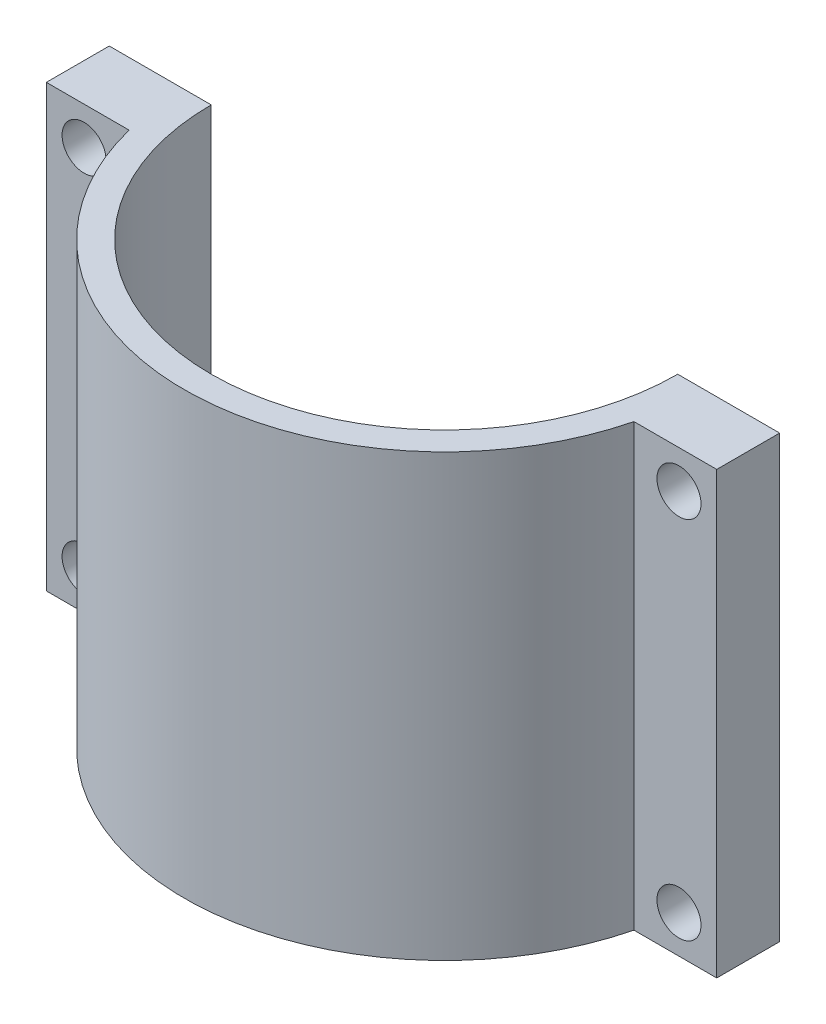
ISO-10303-21;
HEADER;
FILE_DESCRIPTION(('STEP AP214'),'2;1');
FILE_NAME('part.step','',(''),(''),'','','');
FILE_SCHEMA(('AUTOMOTIVE_DESIGN { 1 0 10303 214 1 1 1 1 }'));
ENDSEC;
DATA;
#1=APPLICATION_CONTEXT('core data for automotive mechanical design processes');
#2=APPLICATION_PROTOCOL_DEFINITION('international standard','automotive_design',2000,#1);
#3=PRODUCT_CONTEXT('',#1,'mechanical');
#4=PRODUCT('Part','Part','',(#3));
#5=PRODUCT_RELATED_PRODUCT_CATEGORY('part','',(#4));
#6=PRODUCT_DEFINITION_FORMATION('','',#4);
#7=PRODUCT_DEFINITION_CONTEXT('part definition',#1,'design');
#8=PRODUCT_DEFINITION('design','',#6,#7);
#9=PRODUCT_DEFINITION_SHAPE('','',#8);
#10=(LENGTH_UNIT() NAMED_UNIT(*) SI_UNIT(.MILLI.,.METRE.));
#11=(NAMED_UNIT(*) PLANE_ANGLE_UNIT() SI_UNIT($,.RADIAN.));
#12=(NAMED_UNIT(*) SI_UNIT($,.STERADIAN.) SOLID_ANGLE_UNIT());
#13=UNCERTAINTY_MEASURE_WITH_UNIT(LENGTH_MEASURE(1.E-05),#10,'distance_accuracy_value','');
#14=(GEOMETRIC_REPRESENTATION_CONTEXT(3) GLOBAL_UNCERTAINTY_ASSIGNED_CONTEXT((#13)) GLOBAL_UNIT_ASSIGNED_CONTEXT((#10,
#11,#12)) REPRESENTATION_CONTEXT('',''));
#15=CARTESIAN_POINT('',(0.,0.,0.));
#16=DIRECTION('',(0.,0.,1.));
#17=DIRECTION('',(1.,0.,0.));
#18=AXIS2_PLACEMENT_3D('',#15,#16,#17);
#19=CARTESIAN_POINT('',(23.635,-78.2195250949207,0.));
#20=DIRECTION('',(0.,1.,0.));
#21=DIRECTION('',(0.,0.,1.));
#22=AXIS2_PLACEMENT_3D('',#19,#20,#21);
#23=CYLINDRICAL_SURFACE('',#22,20.67);
#24=CARTESIAN_POINT('',(23.635,-32.,0.));
#25=DIRECTION('',(0.,1.,0.));
#26=DIRECTION('',(0.,0.,1.));
#27=AXIS2_PLACEMENT_3D('',#24,#25,#26);
#28=CIRCLE('',#27,20.67);
#29=CARTESIAN_POINT('',(43.6911436971318,-32.,5.));
#30=VERTEX_POINT('',#29);
#31=CARTESIAN_POINT('',(3.57885630286819,-32.,5.));
#32=VERTEX_POINT('',#31);
#33=EDGE_CURVE('E59',#30,#32,#28,.F.);
#34=ORIENTED_EDGE('',*,*,#33,.F.);
#35=DIRECTION('',(0.,1.,0.));
#36=VECTOR('',#35,1.);
#37=CARTESIAN_POINT('',(43.6911436971318,-78.2195250949207,5.));
#38=LINE('',#37,#36);
#39=CARTESIAN_POINT('',(43.6911436971318,3.00000000000002,5.));
#40=VERTEX_POINT('',#39);
#41=EDGE_CURVE('E11',#30,#40,#38,.T.);
#42=ORIENTED_EDGE('',*,*,#41,.T.);
#43=CARTESIAN_POINT('',(23.635,3.00000000000002,0.));
#44=DIRECTION('',(0.,1.,0.));
#45=DIRECTION('',(0.,0.,1.));
#46=AXIS2_PLACEMENT_3D('',#43,#44,#45);
#47=CIRCLE('',#46,20.67);
#48=CARTESIAN_POINT('',(3.57885630286819,3.00000000000002,5.));
#49=VERTEX_POINT('',#48);
#50=EDGE_CURVE('E145',#49,#40,#47,.T.);
#51=ORIENTED_EDGE('',*,*,#50,.F.);
#52=DIRECTION('',(0.,1.,0.));
#53=VECTOR('',#52,1.);
#54=CARTESIAN_POINT('',(3.5788563028682,-78.2195250949207,5.));
#55=LINE('',#54,#53);
#56=EDGE_CURVE('E111',#49,#32,#55,.F.);
#57=ORIENTED_EDGE('',*,*,#56,.T.);
#58=EDGE_LOOP('',(#34,#42,#51,#57));
#59=FACE_BOUND('',#58,.T.);
#60=ADVANCED_FACE('F39',(#59),#23,.T.);
#61=CARTESIAN_POINT('',(0.,0.,5.));
#62=DIRECTION('',(0.,0.,1.));
#63=DIRECTION('',(1.,0.,0.));
#64=AXIS2_PLACEMENT_3D('',#61,#62,#63);
#65=PLANE('',#64);
#66=ORIENTED_EDGE('',*,*,#56,.F.);
#67=DIRECTION('',(-1.,0.,0.));
#68=VECTOR('',#67,1.);
#69=CARTESIAN_POINT('',(-3.,3.00000000000008,5.));
#70=LINE('',#69,#68);
#71=CARTESIAN_POINT('',(-3.,3.00000000000008,5.));
#72=VERTEX_POINT('',#71);
#73=EDGE_CURVE('E178',#49,#72,#70,.T.);
#74=ORIENTED_EDGE('',*,*,#73,.T.);
#75=DIRECTION('',(0.,-1.,0.));
#76=VECTOR('',#75,1.);
#77=CARTESIAN_POINT('',(-3.,3.00000000000008,5.));
#78=LINE('',#77,#76);
#79=CARTESIAN_POINT('',(-3.,-32.,5.));
#80=VERTEX_POINT('',#79);
#81=EDGE_CURVE('E173',#72,#80,#78,.T.);
#82=ORIENTED_EDGE('',*,*,#81,.T.);
#83=DIRECTION('',(1.,0.,0.));
#84=VECTOR('',#83,1.);
#85=CARTESIAN_POINT('',(-3.,-32.,5.));
#86=LINE('',#85,#84);
#87=EDGE_CURVE('E175',#80,#32,#86,.T.);
#88=ORIENTED_EDGE('',*,*,#87,.T.);
#89=EDGE_LOOP('',(#66,#74,#82,#88));
#90=FACE_BOUND('',#89,.T.);
#91=CARTESIAN_POINT('',(0.,0.,5.));
#92=DIRECTION('',(0.,0.,1.));
#93=DIRECTION('',(1.,0.,0.));
#94=AXIS2_PLACEMENT_3D('',#91,#92,#93);
#95=CIRCLE('',#94,1.74999999999997);
#96=CARTESIAN_POINT('',(1.74999999999997,0.,5.));
#97=VERTEX_POINT('',#96);
#98=EDGE_CURVE('E167',#97,#97,#95,.T.);
#99=ORIENTED_EDGE('',*,*,#98,.F.);
#100=EDGE_LOOP('',(#99));
#101=FACE_BOUND('',#100,.T.);
#102=CARTESIAN_POINT('',(0.,-29.,5.));
#103=DIRECTION('',(0.,0.,1.));
#104=DIRECTION('',(-1.,0.,0.));
#105=AXIS2_PLACEMENT_3D('',#102,#103,#104);
#106=CIRCLE('',#105,1.75);
#107=CARTESIAN_POINT('',(-1.74999999999999,-29.,5.));
#108=VERTEX_POINT('',#107);
#109=EDGE_CURVE('E161',#108,#108,#106,.T.);
#110=ORIENTED_EDGE('',*,*,#109,.F.);
#111=EDGE_LOOP('',(#110));
#112=FACE_BOUND('',#111,.T.);
#113=ADVANCED_FACE('F211',(#90,#101,#112),#65,.T.);
#114=CARTESIAN_POINT('',(0.,0.,0.));
#115=DIRECTION('',(0.,0.,1.));
#116=DIRECTION('',(1.,0.,0.));
#117=AXIS2_PLACEMENT_3D('',#114,#115,#116);
#118=PLANE('',#117);
#119=DIRECTION('',(0.,-1.,0.));
#120=VECTOR('',#119,1.);
#121=CARTESIAN_POINT('',(-3.,-32.,0.));
#122=LINE('',#121,#120);
#123=CARTESIAN_POINT('',(-3.,3.00000000000008,0.));
#124=VERTEX_POINT('',#123);
#125=CARTESIAN_POINT('',(-3.,-32.,0.));
#126=VERTEX_POINT('',#125);
#127=EDGE_CURVE('E170',#124,#126,#122,.T.);
#128=ORIENTED_EDGE('',*,*,#127,.F.);
#129=DIRECTION('',(-1.,0.,0.));
#130=VECTOR('',#129,1.);
#131=CARTESIAN_POINT('',(-3.,3.00000000000008,0.));
#132=LINE('',#131,#130);
#133=CARTESIAN_POINT('',(5.1,3.,0.));
#134=VERTEX_POINT('',#133);
#135=EDGE_CURVE('E176',#134,#124,#132,.T.);
#136=ORIENTED_EDGE('',*,*,#135,.F.);
#137=DIRECTION('',(0.,1.,0.));
#138=VECTOR('',#137,1.);
#139=CARTESIAN_POINT('',(5.1,3.,0.));
#140=LINE('',#139,#138);
#141=CARTESIAN_POINT('',(5.10000000000001,-32.,0.));
#142=VERTEX_POINT('',#141);
#143=EDGE_CURVE('E184',#142,#134,#140,.T.);
#144=ORIENTED_EDGE('',*,*,#143,.F.);
#145=DIRECTION('',(1.,0.,0.));
#146=VECTOR('',#145,1.);
#147=CARTESIAN_POINT('',(-3.,-32.,0.));
#148=LINE('',#147,#146);
#149=EDGE_CURVE('E182',#126,#142,#148,.T.);
#150=ORIENTED_EDGE('',*,*,#149,.F.);
#151=EDGE_LOOP('',(#128,#136,#144,#150));
#152=FACE_BOUND('',#151,.T.);
#153=CARTESIAN_POINT('',(0.,0.,0.));
#154=DIRECTION('',(0.,0.,1.));
#155=DIRECTION('',(1.,0.,0.));
#156=AXIS2_PLACEMENT_3D('',#153,#154,#155);
#157=CIRCLE('',#156,1.74999999999997);
#158=CARTESIAN_POINT('',(1.74999999999997,0.,0.));
#159=VERTEX_POINT('',#158);
#160=EDGE_CURVE('E164',#159,#159,#157,.T.);
#161=ORIENTED_EDGE('',*,*,#160,.T.);
#162=EDGE_LOOP('',(#161));
#163=FACE_BOUND('',#162,.T.);
#164=CARTESIAN_POINT('',(0.,-29.,0.));
#165=DIRECTION('',(0.,0.,1.));
#166=DIRECTION('',(-1.,0.,0.));
#167=AXIS2_PLACEMENT_3D('',#164,#165,#166);
#168=CIRCLE('',#167,1.75);
#169=CARTESIAN_POINT('',(-1.74999999999999,-29.,0.));
#170=VERTEX_POINT('',#169);
#171=EDGE_CURVE('E160',#170,#170,#168,.T.);
#172=ORIENTED_EDGE('',*,*,#171,.T.);
#173=EDGE_LOOP('',(#172));
#174=FACE_BOUND('',#173,.T.);
#175=ADVANCED_FACE('F197',(#152,#163,#174),#118,.F.);
#176=CARTESIAN_POINT('',(-3.,-32.,5.));
#177=DIRECTION('',(1.,0.,0.));
#178=DIRECTION('',(0.,0.,-1.));
#179=AXIS2_PLACEMENT_3D('',#176,#177,#178);
#180=PLANE('',#179);
#181=ORIENTED_EDGE('',*,*,#127,.T.);
#182=DIRECTION('',(0.,0.,-1.));
#183=VECTOR('',#182,1.);
#184=CARTESIAN_POINT('',(-3.,-32.,5.));
#185=LINE('',#184,#183);
#186=EDGE_CURVE('E47',#80,#126,#185,.T.);
#187=ORIENTED_EDGE('',*,*,#186,.F.);
#188=ORIENTED_EDGE('',*,*,#81,.F.);
#189=DIRECTION('',(0.,0.,-1.));
#190=VECTOR('',#189,1.);
#191=CARTESIAN_POINT('',(-3.,3.00000000000008,5.));
#192=LINE('',#191,#190);
#193=EDGE_CURVE('E180',#72,#124,#192,.T.);
#194=ORIENTED_EDGE('',*,*,#193,.T.);
#195=EDGE_LOOP('',(#181,#187,#188,#194));
#196=FACE_BOUND('',#195,.T.);
#197=ADVANCED_FACE('F41',(#196),#180,.F.);
#198=CARTESIAN_POINT('',(-3.,-32.,5.));
#199=DIRECTION('',(0.,1.,0.));
#200=DIRECTION('',(0.,0.,1.));
#201=AXIS2_PLACEMENT_3D('',#198,#199,#200);
#202=PLANE('',#201);
#203=DIRECTION('',(1.,0.,0.));
#204=VECTOR('',#203,1.);
#205=CARTESIAN_POINT('',(42.17,-32.,0.));
#206=LINE('',#205,#204);
#207=CARTESIAN_POINT('',(42.17,-32.,0.));
#208=VERTEX_POINT('',#207);
#209=CARTESIAN_POINT('',(50.27,-32.,0.));
#210=VERTEX_POINT('',#209);
#211=EDGE_CURVE('E102',#208,#210,#206,.T.);
#212=ORIENTED_EDGE('',*,*,#211,.T.);
#213=DIRECTION('',(0.,0.,-1.));
#214=VECTOR('',#213,1.);
#215=CARTESIAN_POINT('',(50.27,-32.,5.));
#216=LINE('',#215,#214);
#217=CARTESIAN_POINT('',(50.27,-32.,5.));
#218=VERTEX_POINT('',#217);
#219=EDGE_CURVE('E105',#218,#210,#216,.T.);
#220=ORIENTED_EDGE('',*,*,#219,.F.);
#221=DIRECTION('',(1.,0.,0.));
#222=VECTOR('',#221,1.);
#223=CARTESIAN_POINT('',(50.27,-32.,5.));
#224=LINE('',#223,#222);
#225=EDGE_CURVE('E54',#30,#218,#224,.T.);
#226=ORIENTED_EDGE('',*,*,#225,.F.);
#227=ORIENTED_EDGE('',*,*,#33,.T.);
#228=ORIENTED_EDGE('',*,*,#87,.F.);
#229=ORIENTED_EDGE('',*,*,#186,.T.);
#230=ORIENTED_EDGE('',*,*,#149,.T.);
#231=CARTESIAN_POINT('',(23.635,-32.,0.));
#232=DIRECTION('',(0.,1.,0.));
#233=DIRECTION('',(0.,0.,1.));
#234=AXIS2_PLACEMENT_3D('',#231,#232,#233);
#235=CIRCLE('',#234,18.535);
#236=EDGE_CURVE('E107',#142,#208,#235,.T.);
#237=ORIENTED_EDGE('',*,*,#236,.T.);
#238=EDGE_LOOP('',(#212,#220,#226,#227,#228,#229,#230,#237));
#239=FACE_BOUND('',#238,.T.);
#240=ADVANCED_FACE('F104',(#239),#202,.F.);
#241=CARTESIAN_POINT('',(-3.,3.00000000000008,5.));
#242=DIRECTION('',(0.,-1.,0.));
#243=DIRECTION('',(1.,0.,0.));
#244=AXIS2_PLACEMENT_3D('',#241,#242,#243);
#245=PLANE('',#244);
#246=ORIENTED_EDGE('',*,*,#50,.T.);
#247=DIRECTION('',(-1.,0.,0.));
#248=VECTOR('',#247,1.);
#249=CARTESIAN_POINT('',(50.27,3.00000000000002,5.));
#250=LINE('',#249,#248);
#251=CARTESIAN_POINT('',(50.27,3.00000000000002,5.));
#252=VERTEX_POINT('',#251);
#253=EDGE_CURVE('E133',#252,#40,#250,.T.);
#254=ORIENTED_EDGE('',*,*,#253,.F.);
#255=DIRECTION('',(0.,0.,-1.));
#256=VECTOR('',#255,1.);
#257=CARTESIAN_POINT('',(50.27,3.00000000000002,5.));
#258=LINE('',#257,#256);
#259=CARTESIAN_POINT('',(50.27,3.00000000000002,0.));
#260=VERTEX_POINT('',#259);
#261=EDGE_CURVE('E122',#252,#260,#258,.T.);
#262=ORIENTED_EDGE('',*,*,#261,.T.);
#263=DIRECTION('',(-1.,0.,0.));
#264=VECTOR('',#263,1.);
#265=CARTESIAN_POINT('',(42.17,3.00000000000002,0.));
#266=LINE('',#265,#264);
#267=CARTESIAN_POINT('',(42.17,3.00000000000002,0.));
#268=VERTEX_POINT('',#267);
#269=EDGE_CURVE('E127',#260,#268,#266,.T.);
#270=ORIENTED_EDGE('',*,*,#269,.T.);
#271=CARTESIAN_POINT('',(23.635,3.00000000000002,0.));
#272=DIRECTION('',(0.,-1.,0.));
#273=DIRECTION('',(0.,0.,1.));
#274=AXIS2_PLACEMENT_3D('',#271,#272,#273);
#275=CIRCLE('',#274,18.535);
#276=EDGE_CURVE('E154',#268,#134,#275,.T.);
#277=ORIENTED_EDGE('',*,*,#276,.T.);
#278=ORIENTED_EDGE('',*,*,#135,.T.);
#279=ORIENTED_EDGE('',*,*,#193,.F.);
#280=ORIENTED_EDGE('',*,*,#73,.F.);
#281=EDGE_LOOP('',(#246,#254,#262,#270,#277,#278,#279,#280));
#282=FACE_BOUND('',#281,.T.);
#283=ADVANCED_FACE('F203',(#282),#245,.F.);
#284=CARTESIAN_POINT('',(0.,0.,5.));
#285=DIRECTION('',(0.,0.,-1.));
#286=DIRECTION('',(-1.,0.,0.));
#287=AXIS2_PLACEMENT_3D('',#284,#285,#286);
#288=CYLINDRICAL_SURFACE('',#287,1.74999999999997);
#289=ORIENTED_EDGE('',*,*,#98,.T.);
#290=EDGE_LOOP('',(#289));
#291=FACE_BOUND('',#290,.T.);
#292=ORIENTED_EDGE('',*,*,#160,.F.);
#293=EDGE_LOOP('',(#292));
#294=FACE_BOUND('',#293,.T.);
#295=ADVANCED_FACE('F233',(#291,#294),#288,.F.);
#296=CARTESIAN_POINT('',(0.,-29.,5.));
#297=DIRECTION('',(0.,0.,-1.));
#298=DIRECTION('',(-1.,0.,0.));
#299=AXIS2_PLACEMENT_3D('',#296,#297,#298);
#300=CYLINDRICAL_SURFACE('',#299,1.75);
#301=ORIENTED_EDGE('',*,*,#109,.T.);
#302=EDGE_LOOP('',(#301));
#303=FACE_BOUND('',#302,.T.);
#304=ORIENTED_EDGE('',*,*,#171,.F.);
#305=EDGE_LOOP('',(#304));
#306=FACE_BOUND('',#305,.T.);
#307=ADVANCED_FACE('F231',(#303,#306),#300,.F.);
#308=CARTESIAN_POINT('',(23.635,-78.2195250949207,0.));
#309=DIRECTION('',(0.,1.,0.));
#310=DIRECTION('',(0.,0.,1.));
#311=AXIS2_PLACEMENT_3D('',#308,#309,#310);
#312=CYLINDRICAL_SURFACE('',#311,18.535);
#313=ORIENTED_EDGE('',*,*,#236,.F.);
#314=ORIENTED_EDGE('',*,*,#143,.T.);
#315=ORIENTED_EDGE('',*,*,#276,.F.);
#316=DIRECTION('',(0.,1.,0.));
#317=VECTOR('',#316,1.);
#318=CARTESIAN_POINT('',(42.17,-78.2195250949207,0.));
#319=LINE('',#318,#317);
#320=EDGE_CURVE('E149',#208,#268,#319,.T.);
#321=ORIENTED_EDGE('',*,*,#320,.F.);
#322=EDGE_LOOP('',(#313,#314,#315,#321));
#323=FACE_BOUND('',#322,.T.);
#324=ADVANCED_FACE('F201',(#323),#312,.F.);
#325=CARTESIAN_POINT('',(42.17,-78.2195250949207,0.));
#326=DIRECTION('',(0.,0.,-1.));
#327=DIRECTION('',(-1.,0.,0.));
#328=AXIS2_PLACEMENT_3D('',#325,#326,#327);
#329=PLANE('',#328);
#330=ORIENTED_EDGE('',*,*,#211,.F.);
#331=ORIENTED_EDGE('',*,*,#320,.T.);
#332=ORIENTED_EDGE('',*,*,#269,.F.);
#333=DIRECTION('',(0.,1.,0.));
#334=VECTOR('',#333,1.);
#335=CARTESIAN_POINT('',(50.27,-32.,0.));
#336=LINE('',#335,#334);
#337=EDGE_CURVE('E118',#210,#260,#336,.T.);
#338=ORIENTED_EDGE('',*,*,#337,.F.);
#339=EDGE_LOOP('',(#330,#331,#332,#338));
#340=FACE_BOUND('',#339,.T.);
#341=CARTESIAN_POINT('',(47.27,0.,0.));
#342=DIRECTION('',(0.,0.,1.));
#343=DIRECTION('',(1.,0.,0.));
#344=AXIS2_PLACEMENT_3D('',#341,#342,#343);
#345=CIRCLE('',#344,1.75);
#346=CARTESIAN_POINT('',(49.02,0.,0.));
#347=VERTEX_POINT('',#346);
#348=EDGE_CURVE('E131',#347,#347,#345,.T.);
#349=ORIENTED_EDGE('',*,*,#348,.T.);
#350=EDGE_LOOP('',(#349));
#351=FACE_BOUND('',#350,.T.);
#352=CARTESIAN_POINT('',(47.27,-29.,0.));
#353=DIRECTION('',(0.,0.,1.));
#354=DIRECTION('',(-1.,0.,0.));
#355=AXIS2_PLACEMENT_3D('',#352,#353,#354);
#356=CIRCLE('',#355,1.75);
#357=CARTESIAN_POINT('',(45.52,-29.,0.));
#358=VERTEX_POINT('',#357);
#359=EDGE_CURVE('E142',#358,#358,#356,.T.);
#360=ORIENTED_EDGE('',*,*,#359,.T.);
#361=EDGE_LOOP('',(#360));
#362=FACE_BOUND('',#361,.T.);
#363=ADVANCED_FACE('F124',(#340,#351,#362),#329,.T.);
#364=CARTESIAN_POINT('',(0.,0.,5.));
#365=DIRECTION('',(0.,0.,-1.));
#366=DIRECTION('',(-1.,0.,0.));
#367=AXIS2_PLACEMENT_3D('',#364,#365,#366);
#368=PLANE('',#367);
#369=ORIENTED_EDGE('',*,*,#41,.F.);
#370=ORIENTED_EDGE('',*,*,#225,.T.);
#371=DIRECTION('',(0.,1.,0.));
#372=VECTOR('',#371,1.);
#373=CARTESIAN_POINT('',(50.27,3.00000000000002,5.));
#374=LINE('',#373,#372);
#375=EDGE_CURVE('E121',#218,#252,#374,.T.);
#376=ORIENTED_EDGE('',*,*,#375,.T.);
#377=ORIENTED_EDGE('',*,*,#253,.T.);
#378=EDGE_LOOP('',(#369,#370,#376,#377));
#379=FACE_BOUND('',#378,.T.);
#380=CARTESIAN_POINT('',(47.27,0.,5.));
#381=DIRECTION('',(0.,0.,1.));
#382=DIRECTION('',(1.,0.,0.));
#383=AXIS2_PLACEMENT_3D('',#380,#381,#382);
#384=CIRCLE('',#383,1.75);
#385=CARTESIAN_POINT('',(49.02,0.,5.));
#386=VERTEX_POINT('',#385);
#387=EDGE_CURVE('E128',#386,#386,#384,.T.);
#388=ORIENTED_EDGE('',*,*,#387,.F.);
#389=EDGE_LOOP('',(#388));
#390=FACE_BOUND('',#389,.T.);
#391=CARTESIAN_POINT('',(47.27,-29.,5.));
#392=DIRECTION('',(0.,0.,1.));
#393=DIRECTION('',(-1.,0.,0.));
#394=AXIS2_PLACEMENT_3D('',#391,#392,#393);
#395=CIRCLE('',#394,1.75);
#396=CARTESIAN_POINT('',(45.52,-29.,5.));
#397=VERTEX_POINT('',#396);
#398=EDGE_CURVE('E140',#397,#397,#395,.T.);
#399=ORIENTED_EDGE('',*,*,#398,.F.);
#400=EDGE_LOOP('',(#399));
#401=FACE_BOUND('',#400,.T.);
#402=ADVANCED_FACE('F207',(#379,#390,#401),#368,.F.);
#403=CARTESIAN_POINT('',(50.27,-32.,5.));
#404=DIRECTION('',(-1.,0.,0.));
#405=DIRECTION('',(0.,0.,1.));
#406=AXIS2_PLACEMENT_3D('',#403,#404,#405);
#407=PLANE('',#406);
#408=ORIENTED_EDGE('',*,*,#337,.T.);
#409=ORIENTED_EDGE('',*,*,#261,.F.);
#410=ORIENTED_EDGE('',*,*,#375,.F.);
#411=ORIENTED_EDGE('',*,*,#219,.T.);
#412=EDGE_LOOP('',(#408,#409,#410,#411));
#413=FACE_BOUND('',#412,.T.);
#414=ADVANCED_FACE('F116',(#413),#407,.F.);
#415=CARTESIAN_POINT('',(47.27,0.,5.));
#416=DIRECTION('',(0.,0.,-1.));
#417=DIRECTION('',(-1.,0.,0.));
#418=AXIS2_PLACEMENT_3D('',#415,#416,#417);
#419=CYLINDRICAL_SURFACE('',#418,1.75);
#420=ORIENTED_EDGE('',*,*,#387,.T.);
#421=EDGE_LOOP('',(#420));
#422=FACE_BOUND('',#421,.T.);
#423=ORIENTED_EDGE('',*,*,#348,.F.);
#424=EDGE_LOOP('',(#423));
#425=FACE_BOUND('',#424,.T.);
#426=ADVANCED_FACE('F268',(#422,#425),#419,.F.);
#427=CARTESIAN_POINT('',(47.27,-29.,5.));
#428=DIRECTION('',(0.,0.,-1.));
#429=DIRECTION('',(-1.,0.,0.));
#430=AXIS2_PLACEMENT_3D('',#427,#428,#429);
#431=CYLINDRICAL_SURFACE('',#430,1.75);
#432=ORIENTED_EDGE('',*,*,#398,.T.);
#433=EDGE_LOOP('',(#432));
#434=FACE_BOUND('',#433,.T.);
#435=ORIENTED_EDGE('',*,*,#359,.F.);
#436=EDGE_LOOP('',(#435));
#437=FACE_BOUND('',#436,.T.);
#438=ADVANCED_FACE('F275',(#434,#437),#431,.F.);
#439=CLOSED_SHELL('',(#60,#113,#175,#197,#240,#283,#295,#307,#324,#363,#402,#414,#426,#438));
#440=MANIFOLD_SOLID_BREP('B2',#439);
#441=ADVANCED_BREP_SHAPE_REPRESENTATION('',(#18,#440),#14);
#442=SHAPE_DEFINITION_REPRESENTATION(#9,#441);
ENDSEC;
END-ISO-10303-21;
